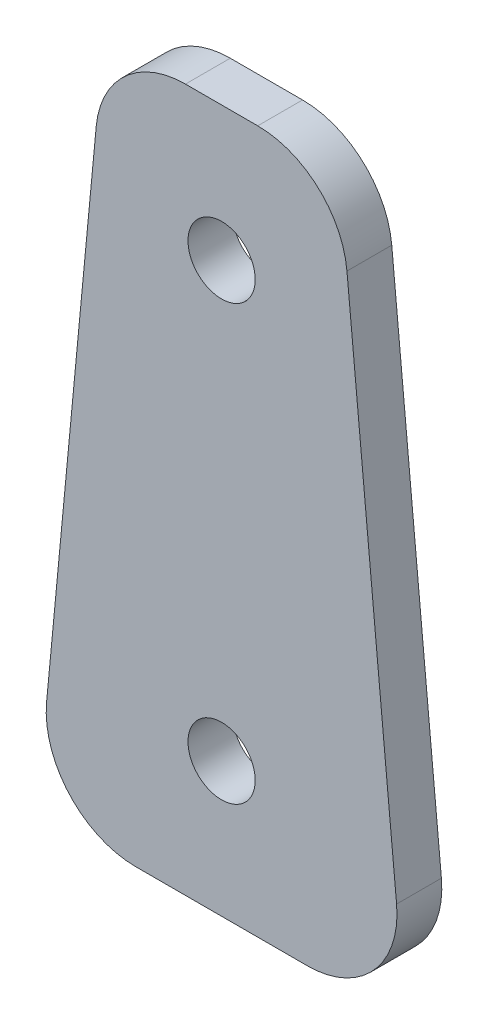
ISO-10303-21;
HEADER;
FILE_DESCRIPTION(('STEP AP214'),'2;1');
FILE_NAME('part.step','',(''),(''),'','','');
FILE_SCHEMA(('AUTOMOTIVE_DESIGN { 1 0 10303 214 1 1 1 1 }'));
ENDSEC;
DATA;
#1=APPLICATION_CONTEXT('core data for automotive mechanical design processes');
#2=APPLICATION_PROTOCOL_DEFINITION('international standard','automotive_design',2000,#1);
#3=PRODUCT_CONTEXT('',#1,'mechanical');
#4=PRODUCT('Part','Part','',(#3));
#5=PRODUCT_RELATED_PRODUCT_CATEGORY('part','',(#4));
#6=PRODUCT_DEFINITION_FORMATION('','',#4);
#7=PRODUCT_DEFINITION_CONTEXT('part definition',#1,'design');
#8=PRODUCT_DEFINITION('design','',#6,#7);
#9=PRODUCT_DEFINITION_SHAPE('','',#8);
#10=(LENGTH_UNIT() NAMED_UNIT(*) SI_UNIT(.MILLI.,.METRE.));
#11=(NAMED_UNIT(*) PLANE_ANGLE_UNIT() SI_UNIT($,.RADIAN.));
#12=(NAMED_UNIT(*) SI_UNIT($,.STERADIAN.) SOLID_ANGLE_UNIT());
#13=UNCERTAINTY_MEASURE_WITH_UNIT(LENGTH_MEASURE(1.E-05),#10,'distance_accuracy_value','');
#14=(GEOMETRIC_REPRESENTATION_CONTEXT(3) GLOBAL_UNCERTAINTY_ASSIGNED_CONTEXT((#13)) GLOBAL_UNIT_ASSIGNED_CONTEXT((#10,
#11,#12)) REPRESENTATION_CONTEXT('',''));
#15=CARTESIAN_POINT('',(0.,0.,0.));
#16=DIRECTION('',(0.,0.,1.));
#17=DIRECTION('',(1.,0.,0.));
#18=AXIS2_PLACEMENT_3D('',#15,#16,#17);
#19=CARTESIAN_POINT('',(21.2517193229762,156.845,3.175));
#20=DIRECTION('',(0.,0.,1.));
#21=DIRECTION('',(1.,0.,0.));
#22=AXIS2_PLACEMENT_3D('',#19,#20,#21);
#23=PLANE('',#22);
#24=CARTESIAN_POINT('',(23.8124999999997,122.936,3.175));
#25=DIRECTION('',(0.,0.,1.));
#26=DIRECTION('',(1.,0.,0.));
#27=AXIS2_PLACEMENT_3D('',#24,#25,#26);
#28=CIRCLE('',#27,2.38125);
#29=CARTESIAN_POINT('',(26.1937499999997,122.936,3.175));
#30=VERTEX_POINT('',#29);
#31=EDGE_CURVE('E134',#30,#30,#28,.T.);
#32=ORIENTED_EDGE('',*,*,#31,.F.);
#33=EDGE_LOOP('',(#32));
#34=FACE_BOUND('',#33,.T.);
#35=CARTESIAN_POINT('',(21.2517193229762,156.845,3.175));
#36=DIRECTION('',(0.,0.,1.));
#37=DIRECTION('',(1.,0.,0.));
#38=AXIS2_PLACEMENT_3D('',#35,#36,#37);
#39=CIRCLE('',#38,6.35);
#40=CARTESIAN_POINT('',(21.2517193229763,163.195,3.175));
#41=VERTEX_POINT('',#40);
#42=CARTESIAN_POINT('',(14.9300786652486,157.44446592444,3.175));
#43=VERTEX_POINT('',#42);
#44=EDGE_CURVE('E145',#41,#43,#39,.T.);
#45=ORIENTED_EDGE('',*,*,#44,.T.);
#46=DIRECTION('',(-0.094404082588928,-0.995533961846879,0.));
#47=VECTOR('',#46,1.);
#48=CARTESIAN_POINT('',(14.9300786652486,157.44446592444,3.175));
#49=LINE('',#48,#47);
#50=CARTESIAN_POINT('',(11.413492458352,120.36046592444,3.175));
#51=VERTEX_POINT('',#50);
#52=EDGE_CURVE('E93',#43,#51,#49,.T.);
#53=ORIENTED_EDGE('',*,*,#52,.T.);
#54=CARTESIAN_POINT('',(17.7351331160797,119.761,3.175));
#55=DIRECTION('',(0.,0.,1.));
#56=DIRECTION('',(-1.,0.,0.));
#57=AXIS2_PLACEMENT_3D('',#54,#55,#56);
#58=CIRCLE('',#57,6.35);
#59=CARTESIAN_POINT('',(17.7351331160797,113.411,3.175));
#60=VERTEX_POINT('',#59);
#61=EDGE_CURVE('E160',#51,#60,#58,.T.);
#62=ORIENTED_EDGE('',*,*,#61,.T.);
#63=DIRECTION('',(1.,0.,0.));
#64=VECTOR('',#63,1.);
#65=CARTESIAN_POINT('',(29.8898668839202,113.411,3.175));
#66=LINE('',#65,#64);
#67=CARTESIAN_POINT('',(29.8898668839202,113.411,3.175));
#68=VERTEX_POINT('',#67);
#69=EDGE_CURVE('E173',#60,#68,#66,.T.);
#70=ORIENTED_EDGE('',*,*,#69,.T.);
#71=CARTESIAN_POINT('',(29.8898668839203,119.761,3.175));
#72=DIRECTION('',(0.,0.,1.));
#73=DIRECTION('',(1.,0.,0.));
#74=AXIS2_PLACEMENT_3D('',#71,#72,#73);
#75=CIRCLE('',#74,6.34999999999999);
#76=CARTESIAN_POINT('',(36.2115075416479,120.36046592444,3.175));
#77=VERTEX_POINT('',#76);
#78=EDGE_CURVE('E112',#68,#77,#75,.T.);
#79=ORIENTED_EDGE('',*,*,#78,.T.);
#80=DIRECTION('',(-0.0944040825889281,0.995533961846879,0.));
#81=VECTOR('',#80,1.);
#82=CARTESIAN_POINT('',(36.2115075416479,120.36046592444,3.175));
#83=LINE('',#82,#81);
#84=CARTESIAN_POINT('',(32.6949213347514,157.44446592444,3.175));
#85=VERTEX_POINT('',#84);
#86=EDGE_CURVE('E106',#77,#85,#83,.T.);
#87=ORIENTED_EDGE('',*,*,#86,.T.);
#88=CARTESIAN_POINT('',(26.3732806770237,156.845,3.175));
#89=DIRECTION('',(0.,0.,1.));
#90=DIRECTION('',(-1.,0.,0.));
#91=AXIS2_PLACEMENT_3D('',#88,#89,#90);
#92=CIRCLE('',#91,6.35);
#93=CARTESIAN_POINT('',(26.3732806770237,163.195,3.175));
#94=VERTEX_POINT('',#93);
#95=EDGE_CURVE('E110',#85,#94,#92,.T.);
#96=ORIENTED_EDGE('',*,*,#95,.T.);
#97=DIRECTION('',(-1.,0.,0.));
#98=VECTOR('',#97,1.);
#99=CARTESIAN_POINT('',(21.2517193229763,163.195,3.175));
#100=LINE('',#99,#98);
#101=EDGE_CURVE('E50',#94,#41,#100,.T.);
#102=ORIENTED_EDGE('',*,*,#101,.T.);
#103=EDGE_LOOP('',(#45,#53,#62,#70,#79,#87,#96,#102));
#104=FACE_BOUND('',#103,.T.);
#105=CARTESIAN_POINT('',(23.8124999999996,153.67,3.175));
#106=DIRECTION('',(0.,0.,1.));
#107=DIRECTION('',(1.,0.,0.));
#108=AXIS2_PLACEMENT_3D('',#105,#106,#107);
#109=CIRCLE('',#108,2.38125000000001);
#110=CARTESIAN_POINT('',(26.1937499999996,153.67,3.175));
#111=VERTEX_POINT('',#110);
#112=EDGE_CURVE('E182',#111,#111,#109,.T.);
#113=ORIENTED_EDGE('',*,*,#112,.F.);
#114=EDGE_LOOP('',(#113));
#115=FACE_BOUND('',#114,.T.);
#116=ADVANCED_FACE('F33',(#34,#104,#115),#23,.T.);
#117=CARTESIAN_POINT('',(21.2517193229762,156.845,0.));
#118=DIRECTION('',(0.,0.,1.));
#119=DIRECTION('',(1.,0.,0.));
#120=AXIS2_PLACEMENT_3D('',#117,#118,#119);
#121=PLANE('',#120);
#122=CARTESIAN_POINT('',(21.2517193229762,156.845,0.));
#123=DIRECTION('',(0.,0.,1.));
#124=DIRECTION('',(1.,0.,0.));
#125=AXIS2_PLACEMENT_3D('',#122,#123,#124);
#126=CIRCLE('',#125,6.35);
#127=CARTESIAN_POINT('',(21.2517193229763,163.195,0.));
#128=VERTEX_POINT('',#127);
#129=CARTESIAN_POINT('',(14.9300786652486,157.44446592444,0.));
#130=VERTEX_POINT('',#129);
#131=EDGE_CURVE('E130',#128,#130,#126,.T.);
#132=ORIENTED_EDGE('',*,*,#131,.F.);
#133=DIRECTION('',(-1.,0.,0.));
#134=VECTOR('',#133,1.);
#135=CARTESIAN_POINT('',(21.2517193229763,163.195,0.));
#136=LINE('',#135,#134);
#137=CARTESIAN_POINT('',(26.3732806770237,163.195,0.));
#138=VERTEX_POINT('',#137);
#139=EDGE_CURVE('E85',#138,#128,#136,.T.);
#140=ORIENTED_EDGE('',*,*,#139,.F.);
#141=CARTESIAN_POINT('',(26.3732806770237,156.845,0.));
#142=DIRECTION('',(0.,0.,1.));
#143=DIRECTION('',(-1.,0.,0.));
#144=AXIS2_PLACEMENT_3D('',#141,#142,#143);
#145=CIRCLE('',#144,6.35);
#146=CARTESIAN_POINT('',(32.6949213347514,157.44446592444,0.));
#147=VERTEX_POINT('',#146);
#148=EDGE_CURVE('E79',#147,#138,#145,.T.);
#149=ORIENTED_EDGE('',*,*,#148,.F.);
#150=DIRECTION('',(-0.0944040825889281,0.995533961846879,0.));
#151=VECTOR('',#150,1.);
#152=CARTESIAN_POINT('',(36.2115075416479,120.36046592444,0.));
#153=LINE('',#152,#151);
#154=CARTESIAN_POINT('',(36.2115075416479,120.36046592444,0.));
#155=VERTEX_POINT('',#154);
#156=EDGE_CURVE('E120',#155,#147,#153,.T.);
#157=ORIENTED_EDGE('',*,*,#156,.F.);
#158=CARTESIAN_POINT('',(29.8898668839203,119.761,0.));
#159=DIRECTION('',(0.,0.,1.));
#160=DIRECTION('',(1.,0.,0.));
#161=AXIS2_PLACEMENT_3D('',#158,#159,#160);
#162=CIRCLE('',#161,6.34999999999999);
#163=CARTESIAN_POINT('',(29.8898668839202,113.411,0.));
#164=VERTEX_POINT('',#163);
#165=EDGE_CURVE('E140',#164,#155,#162,.T.);
#166=ORIENTED_EDGE('',*,*,#165,.F.);
#167=DIRECTION('',(1.,0.,0.));
#168=VECTOR('',#167,1.);
#169=CARTESIAN_POINT('',(29.8898668839202,113.411,0.));
#170=LINE('',#169,#168);
#171=CARTESIAN_POINT('',(17.7351331160797,113.411,0.));
#172=VERTEX_POINT('',#171);
#173=EDGE_CURVE('E138',#172,#164,#170,.T.);
#174=ORIENTED_EDGE('',*,*,#173,.F.);
#175=CARTESIAN_POINT('',(17.7351331160797,119.761,0.));
#176=DIRECTION('',(0.,0.,1.));
#177=DIRECTION('',(-1.,0.,0.));
#178=AXIS2_PLACEMENT_3D('',#175,#176,#177);
#179=CIRCLE('',#178,6.35);
#180=CARTESIAN_POINT('',(11.413492458352,120.36046592444,0.));
#181=VERTEX_POINT('',#180);
#182=EDGE_CURVE('E136',#181,#172,#179,.T.);
#183=ORIENTED_EDGE('',*,*,#182,.F.);
#184=DIRECTION('',(-0.094404082588928,-0.995533961846879,0.));
#185=VECTOR('',#184,1.);
#186=CARTESIAN_POINT('',(14.9300786652486,157.44446592444,0.));
#187=LINE('',#186,#185);
#188=EDGE_CURVE('E133',#130,#181,#187,.T.);
#189=ORIENTED_EDGE('',*,*,#188,.F.);
#190=EDGE_LOOP('',(#132,#140,#149,#157,#166,#174,#183,#189));
#191=FACE_BOUND('',#190,.T.);
#192=CARTESIAN_POINT('',(23.8124999999997,122.936,0.));
#193=DIRECTION('',(0.,0.,1.));
#194=DIRECTION('',(1.,0.,0.));
#195=AXIS2_PLACEMENT_3D('',#192,#193,#194);
#196=CIRCLE('',#195,2.38125);
#197=CARTESIAN_POINT('',(26.1937499999997,122.936,0.));
#198=VERTEX_POINT('',#197);
#199=EDGE_CURVE('E179',#198,#198,#196,.T.);
#200=ORIENTED_EDGE('',*,*,#199,.T.);
#201=EDGE_LOOP('',(#200));
#202=FACE_BOUND('',#201,.T.);
#203=CARTESIAN_POINT('',(23.8124999999996,153.67,0.));
#204=DIRECTION('',(0.,0.,1.));
#205=DIRECTION('',(1.,0.,0.));
#206=AXIS2_PLACEMENT_3D('',#203,#204,#205);
#207=CIRCLE('',#206,2.38125000000001);
#208=CARTESIAN_POINT('',(26.1937499999996,153.67,0.));
#209=VERTEX_POINT('',#208);
#210=EDGE_CURVE('E185',#209,#209,#207,.T.);
#211=ORIENTED_EDGE('',*,*,#210,.T.);
#212=EDGE_LOOP('',(#211));
#213=FACE_BOUND('',#212,.T.);
#214=ADVANCED_FACE('F164',(#191,#202,#213),#121,.F.);
#215=CARTESIAN_POINT('',(21.2517193229762,156.845,3.175));
#216=DIRECTION('',(0.,0.,-1.));
#217=DIRECTION('',(-1.,0.,0.));
#218=AXIS2_PLACEMENT_3D('',#215,#216,#217);
#219=CYLINDRICAL_SURFACE('',#218,6.35);
#220=ORIENTED_EDGE('',*,*,#131,.T.);
#221=DIRECTION('',(0.,0.,-1.));
#222=VECTOR('',#221,1.);
#223=CARTESIAN_POINT('',(14.9300786652486,157.44446592444,3.175));
#224=LINE('',#223,#222);
#225=EDGE_CURVE('E11',#43,#130,#224,.T.);
#226=ORIENTED_EDGE('',*,*,#225,.F.);
#227=ORIENTED_EDGE('',*,*,#44,.F.);
#228=DIRECTION('',(0.,0.,-1.));
#229=VECTOR('',#228,1.);
#230=CARTESIAN_POINT('',(21.2517193229763,163.195,3.175));
#231=LINE('',#230,#229);
#232=EDGE_CURVE('E126',#41,#128,#231,.T.);
#233=ORIENTED_EDGE('',*,*,#232,.T.);
#234=EDGE_LOOP('',(#220,#226,#227,#233));
#235=FACE_BOUND('',#234,.T.);
#236=ADVANCED_FACE('F35',(#235),#219,.T.);
#237=CARTESIAN_POINT('',(14.9300786652486,157.44446592444,3.175));
#238=DIRECTION('',(0.995533961846879,-0.094404082588928,0.));
#239=DIRECTION('',(0.094404082588928,0.995533961846879,0.));
#240=AXIS2_PLACEMENT_3D('',#237,#238,#239);
#241=PLANE('',#240);
#242=ORIENTED_EDGE('',*,*,#188,.T.);
#243=DIRECTION('',(0.,0.,-1.));
#244=VECTOR('',#243,1.);
#245=CARTESIAN_POINT('',(11.413492458352,120.36046592444,3.175));
#246=LINE('',#245,#244);
#247=EDGE_CURVE('E42',#51,#181,#246,.T.);
#248=ORIENTED_EDGE('',*,*,#247,.F.);
#249=ORIENTED_EDGE('',*,*,#52,.F.);
#250=ORIENTED_EDGE('',*,*,#225,.T.);
#251=EDGE_LOOP('',(#242,#248,#249,#250));
#252=FACE_BOUND('',#251,.T.);
#253=ADVANCED_FACE('F217',(#252),#241,.F.);
#254=CARTESIAN_POINT('',(17.7351331160797,119.761,3.175));
#255=DIRECTION('',(0.,0.,-1.));
#256=DIRECTION('',(-1.,0.,0.));
#257=AXIS2_PLACEMENT_3D('',#254,#255,#256);
#258=CYLINDRICAL_SURFACE('',#257,6.35);
#259=ORIENTED_EDGE('',*,*,#182,.T.);
#260=DIRECTION('',(0.,0.,-1.));
#261=VECTOR('',#260,1.);
#262=CARTESIAN_POINT('',(17.7351331160797,113.411,3.175));
#263=LINE('',#262,#261);
#264=EDGE_CURVE('E152',#60,#172,#263,.T.);
#265=ORIENTED_EDGE('',*,*,#264,.F.);
#266=ORIENTED_EDGE('',*,*,#61,.F.);
#267=ORIENTED_EDGE('',*,*,#247,.T.);
#268=EDGE_LOOP('',(#259,#265,#266,#267));
#269=FACE_BOUND('',#268,.T.);
#270=ADVANCED_FACE('F158',(#269),#258,.T.);
#271=CARTESIAN_POINT('',(29.8898668839202,113.411,3.175));
#272=DIRECTION('',(0.,1.,0.));
#273=DIRECTION('',(0.,0.,1.));
#274=AXIS2_PLACEMENT_3D('',#271,#272,#273);
#275=PLANE('',#274);
#276=ORIENTED_EDGE('',*,*,#173,.T.);
#277=DIRECTION('',(0.,0.,-1.));
#278=VECTOR('',#277,1.);
#279=CARTESIAN_POINT('',(29.8898668839202,113.411,3.175));
#280=LINE('',#279,#278);
#281=EDGE_CURVE('E149',#68,#164,#280,.T.);
#282=ORIENTED_EDGE('',*,*,#281,.F.);
#283=ORIENTED_EDGE('',*,*,#69,.F.);
#284=ORIENTED_EDGE('',*,*,#264,.T.);
#285=EDGE_LOOP('',(#276,#282,#283,#284));
#286=FACE_BOUND('',#285,.T.);
#287=ADVANCED_FACE('F169',(#286),#275,.F.);
#288=CARTESIAN_POINT('',(29.8898668839203,119.761,3.175));
#289=DIRECTION('',(0.,0.,-1.));
#290=DIRECTION('',(-1.,0.,0.));
#291=AXIS2_PLACEMENT_3D('',#288,#289,#290);
#292=CYLINDRICAL_SURFACE('',#291,6.34999999999999);
#293=ORIENTED_EDGE('',*,*,#165,.T.);
#294=DIRECTION('',(0.,0.,-1.));
#295=VECTOR('',#294,1.);
#296=CARTESIAN_POINT('',(36.2115075416479,120.36046592444,3.175));
#297=LINE('',#296,#295);
#298=EDGE_CURVE('E121',#77,#155,#297,.T.);
#299=ORIENTED_EDGE('',*,*,#298,.F.);
#300=ORIENTED_EDGE('',*,*,#78,.F.);
#301=ORIENTED_EDGE('',*,*,#281,.T.);
#302=EDGE_LOOP('',(#293,#299,#300,#301));
#303=FACE_BOUND('',#302,.T.);
#304=ADVANCED_FACE('F172',(#303),#292,.T.);
#305=CARTESIAN_POINT('',(36.2115075416479,120.36046592444,3.175));
#306=DIRECTION('',(-0.995533961846879,-0.0944040825889281,0.));
#307=DIRECTION('',(0.0944040825889281,-0.995533961846879,0.));
#308=AXIS2_PLACEMENT_3D('',#305,#306,#307);
#309=PLANE('',#308);
#310=ORIENTED_EDGE('',*,*,#156,.T.);
#311=DIRECTION('',(0.,0.,-1.));
#312=VECTOR('',#311,1.);
#313=CARTESIAN_POINT('',(32.6949213347514,157.44446592444,3.175));
#314=LINE('',#313,#312);
#315=EDGE_CURVE('E117',#85,#147,#314,.T.);
#316=ORIENTED_EDGE('',*,*,#315,.F.);
#317=ORIENTED_EDGE('',*,*,#86,.F.);
#318=ORIENTED_EDGE('',*,*,#298,.T.);
#319=EDGE_LOOP('',(#310,#316,#317,#318));
#320=FACE_BOUND('',#319,.T.);
#321=ADVANCED_FACE('F118',(#320),#309,.F.);
#322=CARTESIAN_POINT('',(26.3732806770237,156.845,3.175));
#323=DIRECTION('',(0.,0.,-1.));
#324=DIRECTION('',(-1.,0.,0.));
#325=AXIS2_PLACEMENT_3D('',#322,#323,#324);
#326=CYLINDRICAL_SURFACE('',#325,6.35);
#327=ORIENTED_EDGE('',*,*,#148,.T.);
#328=DIRECTION('',(0.,0.,-1.));
#329=VECTOR('',#328,1.);
#330=CARTESIAN_POINT('',(26.3732806770237,163.195,3.175));
#331=LINE('',#330,#329);
#332=EDGE_CURVE('E122',#94,#138,#331,.T.);
#333=ORIENTED_EDGE('',*,*,#332,.F.);
#334=ORIENTED_EDGE('',*,*,#95,.F.);
#335=ORIENTED_EDGE('',*,*,#315,.T.);
#336=EDGE_LOOP('',(#327,#333,#334,#335));
#337=FACE_BOUND('',#336,.T.);
#338=ADVANCED_FACE('F124',(#337),#326,.T.);
#339=CARTESIAN_POINT('',(21.2517193229763,163.195,3.175));
#340=DIRECTION('',(0.,-1.,0.));
#341=DIRECTION('',(0.,0.,-1.));
#342=AXIS2_PLACEMENT_3D('',#339,#340,#341);
#343=PLANE('',#342);
#344=ORIENTED_EDGE('',*,*,#139,.T.);
#345=ORIENTED_EDGE('',*,*,#232,.F.);
#346=ORIENTED_EDGE('',*,*,#101,.F.);
#347=ORIENTED_EDGE('',*,*,#332,.T.);
#348=EDGE_LOOP('',(#344,#345,#346,#347));
#349=FACE_BOUND('',#348,.T.);
#350=ADVANCED_FACE('F205',(#349),#343,.F.);
#351=CARTESIAN_POINT('',(23.8124999999997,122.936,3.175));
#352=DIRECTION('',(0.,0.,-1.));
#353=DIRECTION('',(-1.,0.,0.));
#354=AXIS2_PLACEMENT_3D('',#351,#352,#353);
#355=CYLINDRICAL_SURFACE('',#354,2.38125);
#356=ORIENTED_EDGE('',*,*,#31,.T.);
#357=EDGE_LOOP('',(#356));
#358=FACE_BOUND('',#357,.T.);
#359=ORIENTED_EDGE('',*,*,#199,.F.);
#360=EDGE_LOOP('',(#359));
#361=FACE_BOUND('',#360,.T.);
#362=ADVANCED_FACE('F202',(#358,#361),#355,.F.);
#363=CARTESIAN_POINT('',(23.8124999999996,153.67,3.175));
#364=DIRECTION('',(0.,0.,-1.));
#365=DIRECTION('',(-1.,0.,0.));
#366=AXIS2_PLACEMENT_3D('',#363,#364,#365);
#367=CYLINDRICAL_SURFACE('',#366,2.38125000000001);
#368=ORIENTED_EDGE('',*,*,#112,.T.);
#369=EDGE_LOOP('',(#368));
#370=FACE_BOUND('',#369,.T.);
#371=ORIENTED_EDGE('',*,*,#210,.F.);
#372=EDGE_LOOP('',(#371));
#373=FACE_BOUND('',#372,.T.);
#374=ADVANCED_FACE('F191',(#370,#373),#367,.F.);
#375=CLOSED_SHELL('',(#116,#214,#236,#253,#270,#287,#304,#321,#338,#350,#362,#374));
#376=MANIFOLD_SOLID_BREP('B2',#375);
#377=ADVANCED_BREP_SHAPE_REPRESENTATION('',(#18,#376),#14);
#378=SHAPE_DEFINITION_REPRESENTATION(#9,#377);
ENDSEC;
END-ISO-10303-21;
